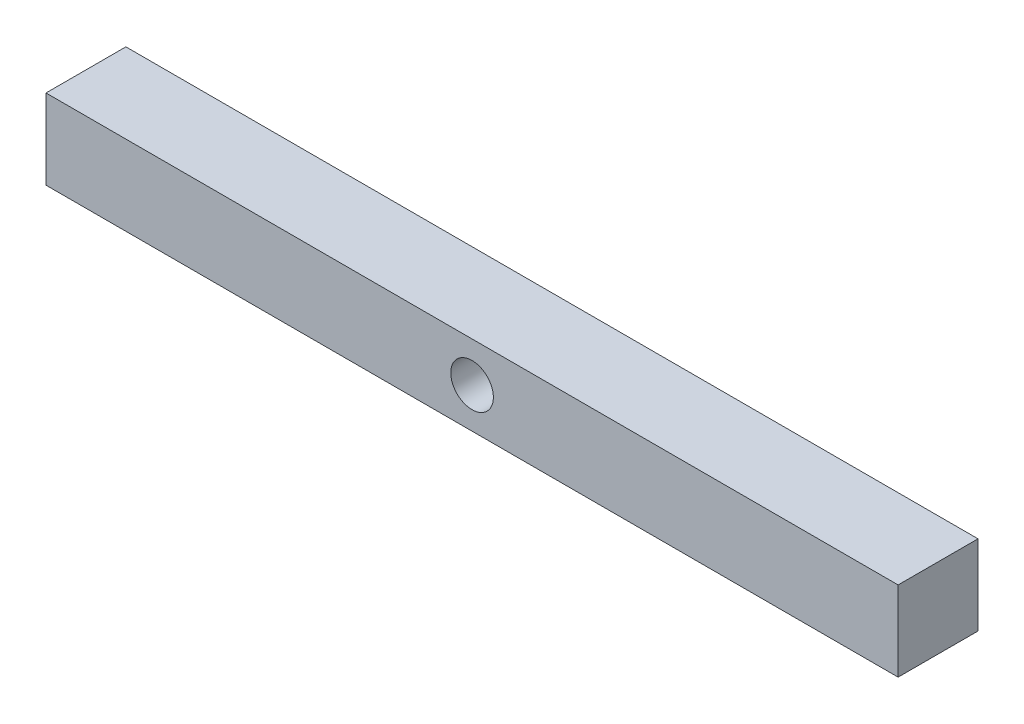
ISO-10303-21;
HEADER;
FILE_DESCRIPTION(('STEP AP214'),'2;1');
FILE_NAME('part.step','',(''),(''),'','','');
FILE_SCHEMA(('AUTOMOTIVE_DESIGN { 1 0 10303 214 1 1 1 1 }'));
ENDSEC;
DATA;
#1=APPLICATION_CONTEXT('core data for automotive mechanical design processes');
#2=APPLICATION_PROTOCOL_DEFINITION('international standard','automotive_design',2000,#1);
#3=PRODUCT_CONTEXT('',#1,'mechanical');
#4=PRODUCT('Part','Part','',(#3));
#5=PRODUCT_RELATED_PRODUCT_CATEGORY('part','',(#4));
#6=PRODUCT_DEFINITION_FORMATION('','',#4);
#7=PRODUCT_DEFINITION_CONTEXT('part definition',#1,'design');
#8=PRODUCT_DEFINITION('design','',#6,#7);
#9=PRODUCT_DEFINITION_SHAPE('','',#8);
#10=(LENGTH_UNIT() NAMED_UNIT(*) SI_UNIT(.MILLI.,.METRE.));
#11=(NAMED_UNIT(*) PLANE_ANGLE_UNIT() SI_UNIT($,.RADIAN.));
#12=(NAMED_UNIT(*) SI_UNIT($,.STERADIAN.) SOLID_ANGLE_UNIT());
#13=UNCERTAINTY_MEASURE_WITH_UNIT(LENGTH_MEASURE(1.E-05),#10,'distance_accuracy_value','');
#14=(GEOMETRIC_REPRESENTATION_CONTEXT(3) GLOBAL_UNCERTAINTY_ASSIGNED_CONTEXT((#13)) GLOBAL_UNIT_ASSIGNED_CONTEXT((#10,
#11,#12)) REPRESENTATION_CONTEXT('',''));
#15=CARTESIAN_POINT('',(0.,0.,0.));
#16=DIRECTION('',(0.,0.,1.));
#17=DIRECTION('',(1.,0.,0.));
#18=AXIS2_PLACEMENT_3D('',#15,#16,#17);
#19=CARTESIAN_POINT('',(0.,-1.,-3.));
#20=DIRECTION('',(-1.,0.,0.));
#21=DIRECTION('',(0.,0.,1.));
#22=AXIS2_PLACEMENT_3D('',#19,#20,#21);
#23=PLANE('',#22);
#24=DIRECTION('',(0.,1.,0.));
#25=VECTOR('',#24,1.);
#26=CARTESIAN_POINT('',(0.,-1.,0.));
#27=LINE('',#26,#25);
#28=CARTESIAN_POINT('',(0.,-1.,0.));
#29=VERTEX_POINT('',#28);
#30=CARTESIAN_POINT('',(0.,2.,0.));
#31=VERTEX_POINT('',#30);
#32=EDGE_CURVE('E36',#29,#31,#27,.T.);
#33=ORIENTED_EDGE('',*,*,#32,.T.);
#34=DIRECTION('',(0.,0.,1.));
#35=VECTOR('',#34,1.);
#36=CARTESIAN_POINT('',(0.,2.,-3.));
#37=LINE('',#36,#35);
#38=CARTESIAN_POINT('',(0.,2.,-3.));
#39=VERTEX_POINT('',#38);
#40=EDGE_CURVE('E73',#39,#31,#37,.T.);
#41=ORIENTED_EDGE('',*,*,#40,.F.);
#42=DIRECTION('',(0.,1.,0.));
#43=VECTOR('',#42,1.);
#44=CARTESIAN_POINT('',(0.,-1.,-3.));
#45=LINE('',#44,#43);
#46=CARTESIAN_POINT('',(0.,-1.,-3.));
#47=VERTEX_POINT('',#46);
#48=EDGE_CURVE('E11',#47,#39,#45,.T.);
#49=ORIENTED_EDGE('',*,*,#48,.F.);
#50=DIRECTION('',(0.,0.,1.));
#51=VECTOR('',#50,1.);
#52=CARTESIAN_POINT('',(0.,-1.,-3.));
#53=LINE('',#52,#51);
#54=EDGE_CURVE('E74',#47,#29,#53,.T.);
#55=ORIENTED_EDGE('',*,*,#54,.T.);
#56=EDGE_LOOP('',(#33,#41,#49,#55));
#57=FACE_BOUND('',#56,.T.);
#58=ADVANCED_FACE('F33',(#57),#23,.T.);
#59=CARTESIAN_POINT('',(32.,-1.,-3.));
#60=DIRECTION('',(0.,0.,-1.));
#61=DIRECTION('',(-1.,0.,0.));
#62=AXIS2_PLACEMENT_3D('',#59,#60,#61);
#63=PLANE('',#62);
#64=CARTESIAN_POINT('',(16.,0.499999999999998,-3.));
#65=DIRECTION('',(0.,0.,-1.));
#66=DIRECTION('',(-1.,0.,0.));
#67=AXIS2_PLACEMENT_3D('',#64,#65,#66);
#68=CIRCLE('',#67,0.799999999999999);
#69=CARTESIAN_POINT('',(15.2,0.499999999999998,-3.));
#70=VERTEX_POINT('',#69);
#71=EDGE_CURVE('E91',#70,#70,#68,.T.);
#72=ORIENTED_EDGE('',*,*,#71,.F.);
#73=EDGE_LOOP('',(#72));
#74=FACE_BOUND('',#73,.T.);
#75=ORIENTED_EDGE('',*,*,#48,.T.);
#76=DIRECTION('',(-1.,0.,0.));
#77=VECTOR('',#76,1.);
#78=CARTESIAN_POINT('',(32.,2.,-3.));
#79=LINE('',#78,#77);
#80=CARTESIAN_POINT('',(32.,2.,-3.));
#81=VERTEX_POINT('',#80);
#82=EDGE_CURVE('E90',#81,#39,#79,.T.);
#83=ORIENTED_EDGE('',*,*,#82,.F.);
#84=DIRECTION('',(0.,1.,0.));
#85=VECTOR('',#84,1.);
#86=CARTESIAN_POINT('',(32.,-1.,-3.));
#87=LINE('',#86,#85);
#88=CARTESIAN_POINT('',(32.,-1.,-3.));
#89=VERTEX_POINT('',#88);
#90=EDGE_CURVE('E41',#89,#81,#87,.T.);
#91=ORIENTED_EDGE('',*,*,#90,.F.);
#92=DIRECTION('',(-1.,0.,0.));
#93=VECTOR('',#92,1.);
#94=CARTESIAN_POINT('',(32.,-1.,-3.));
#95=LINE('',#94,#93);
#96=EDGE_CURVE('E79',#89,#47,#95,.T.);
#97=ORIENTED_EDGE('',*,*,#96,.T.);
#98=EDGE_LOOP('',(#75,#83,#91,#97));
#99=FACE_BOUND('',#98,.T.);
#100=ADVANCED_FACE('F110',(#74,#99),#63,.T.);
#101=CARTESIAN_POINT('',(32.,-1.,0.));
#102=DIRECTION('',(1.,0.,0.));
#103=DIRECTION('',(0.,0.,-1.));
#104=AXIS2_PLACEMENT_3D('',#101,#102,#103);
#105=PLANE('',#104);
#106=ORIENTED_EDGE('',*,*,#90,.T.);
#107=DIRECTION('',(0.,0.,-1.));
#108=VECTOR('',#107,1.);
#109=CARTESIAN_POINT('',(32.,2.,0.));
#110=LINE('',#109,#108);
#111=CARTESIAN_POINT('',(32.,2.,0.));
#112=VERTEX_POINT('',#111);
#113=EDGE_CURVE('E86',#112,#81,#110,.T.);
#114=ORIENTED_EDGE('',*,*,#113,.F.);
#115=DIRECTION('',(0.,1.,0.));
#116=VECTOR('',#115,1.);
#117=CARTESIAN_POINT('',(32.,-1.,0.));
#118=LINE('',#117,#116);
#119=CARTESIAN_POINT('',(32.,-1.,0.));
#120=VERTEX_POINT('',#119);
#121=EDGE_CURVE('E78',#120,#112,#118,.T.);
#122=ORIENTED_EDGE('',*,*,#121,.F.);
#123=DIRECTION('',(0.,0.,-1.));
#124=VECTOR('',#123,1.);
#125=CARTESIAN_POINT('',(32.,-1.,0.));
#126=LINE('',#125,#124);
#127=EDGE_CURVE('E103',#120,#89,#126,.T.);
#128=ORIENTED_EDGE('',*,*,#127,.T.);
#129=EDGE_LOOP('',(#106,#114,#122,#128));
#130=FACE_BOUND('',#129,.T.);
#131=ADVANCED_FACE('F107',(#130),#105,.T.);
#132=CARTESIAN_POINT('',(0.,-1.,0.));
#133=DIRECTION('',(0.,0.,1.));
#134=DIRECTION('',(1.,0.,0.));
#135=AXIS2_PLACEMENT_3D('',#132,#133,#134);
#136=PLANE('',#135);
#137=CARTESIAN_POINT('',(16.,0.499999999999998,0.));
#138=DIRECTION('',(0.,0.,1.));
#139=DIRECTION('',(1.,0.,0.));
#140=AXIS2_PLACEMENT_3D('',#137,#138,#139);
#141=CIRCLE('',#140,0.799999999999999);
#142=CARTESIAN_POINT('',(16.8,0.499999999999998,0.));
#143=VERTEX_POINT('',#142);
#144=EDGE_CURVE('E94',#143,#143,#141,.T.);
#145=ORIENTED_EDGE('',*,*,#144,.F.);
#146=EDGE_LOOP('',(#145));
#147=FACE_BOUND('',#146,.T.);
#148=ORIENTED_EDGE('',*,*,#121,.T.);
#149=DIRECTION('',(1.,0.,0.));
#150=VECTOR('',#149,1.);
#151=CARTESIAN_POINT('',(0.,2.,0.));
#152=LINE('',#151,#150);
#153=EDGE_CURVE('E81',#31,#112,#152,.T.);
#154=ORIENTED_EDGE('',*,*,#153,.F.);
#155=ORIENTED_EDGE('',*,*,#32,.F.);
#156=DIRECTION('',(1.,0.,0.));
#157=VECTOR('',#156,1.);
#158=CARTESIAN_POINT('',(0.,-1.,0.));
#159=LINE('',#158,#157);
#160=EDGE_CURVE('E101',#29,#120,#159,.T.);
#161=ORIENTED_EDGE('',*,*,#160,.T.);
#162=EDGE_LOOP('',(#148,#154,#155,#161));
#163=FACE_BOUND('',#162,.T.);
#164=ADVANCED_FACE('F82',(#147,#163),#136,.T.);
#165=CARTESIAN_POINT('',(0.,-1.,0.));
#166=DIRECTION('',(0.,1.,0.));
#167=DIRECTION('',(0.,0.,1.));
#168=AXIS2_PLACEMENT_3D('',#165,#166,#167);
#169=PLANE('',#168);
#170=ORIENTED_EDGE('',*,*,#54,.F.);
#171=ORIENTED_EDGE('',*,*,#96,.F.);
#172=ORIENTED_EDGE('',*,*,#127,.F.);
#173=ORIENTED_EDGE('',*,*,#160,.F.);
#174=EDGE_LOOP('',(#170,#171,#172,#173));
#175=FACE_BOUND('',#174,.T.);
#176=ADVANCED_FACE('F112',(#175),#169,.F.);
#177=CARTESIAN_POINT('',(0.,2.,0.));
#178=DIRECTION('',(0.,1.,0.));
#179=DIRECTION('',(0.,0.,1.));
#180=AXIS2_PLACEMENT_3D('',#177,#178,#179);
#181=PLANE('',#180);
#182=ORIENTED_EDGE('',*,*,#40,.T.);
#183=ORIENTED_EDGE('',*,*,#153,.T.);
#184=ORIENTED_EDGE('',*,*,#113,.T.);
#185=ORIENTED_EDGE('',*,*,#82,.T.);
#186=EDGE_LOOP('',(#182,#183,#184,#185));
#187=FACE_BOUND('',#186,.T.);
#188=ADVANCED_FACE('F89',(#187),#181,.T.);
#189=CARTESIAN_POINT('',(16.,0.499999999999998,0.));
#190=DIRECTION('',(0.,0.,1.));
#191=DIRECTION('',(1.,0.,0.));
#192=AXIS2_PLACEMENT_3D('',#189,#190,#191);
#193=CYLINDRICAL_SURFACE('',#192,0.799999999999999);
#194=ORIENTED_EDGE('',*,*,#144,.T.);
#195=EDGE_LOOP('',(#194));
#196=FACE_BOUND('',#195,.T.);
#197=ORIENTED_EDGE('',*,*,#71,.T.);
#198=EDGE_LOOP('',(#197));
#199=FACE_BOUND('',#198,.T.);
#200=ADVANCED_FACE('F119',(#196,#199),#193,.F.);
#201=CLOSED_SHELL('',(#58,#100,#131,#164,#176,#188,#200));
#202=MANIFOLD_SOLID_BREP('B2',#201);
#203=ADVANCED_BREP_SHAPE_REPRESENTATION('',(#18,#202),#14);
#204=SHAPE_DEFINITION_REPRESENTATION(#9,#203);
ENDSEC;
END-ISO-10303-21;
